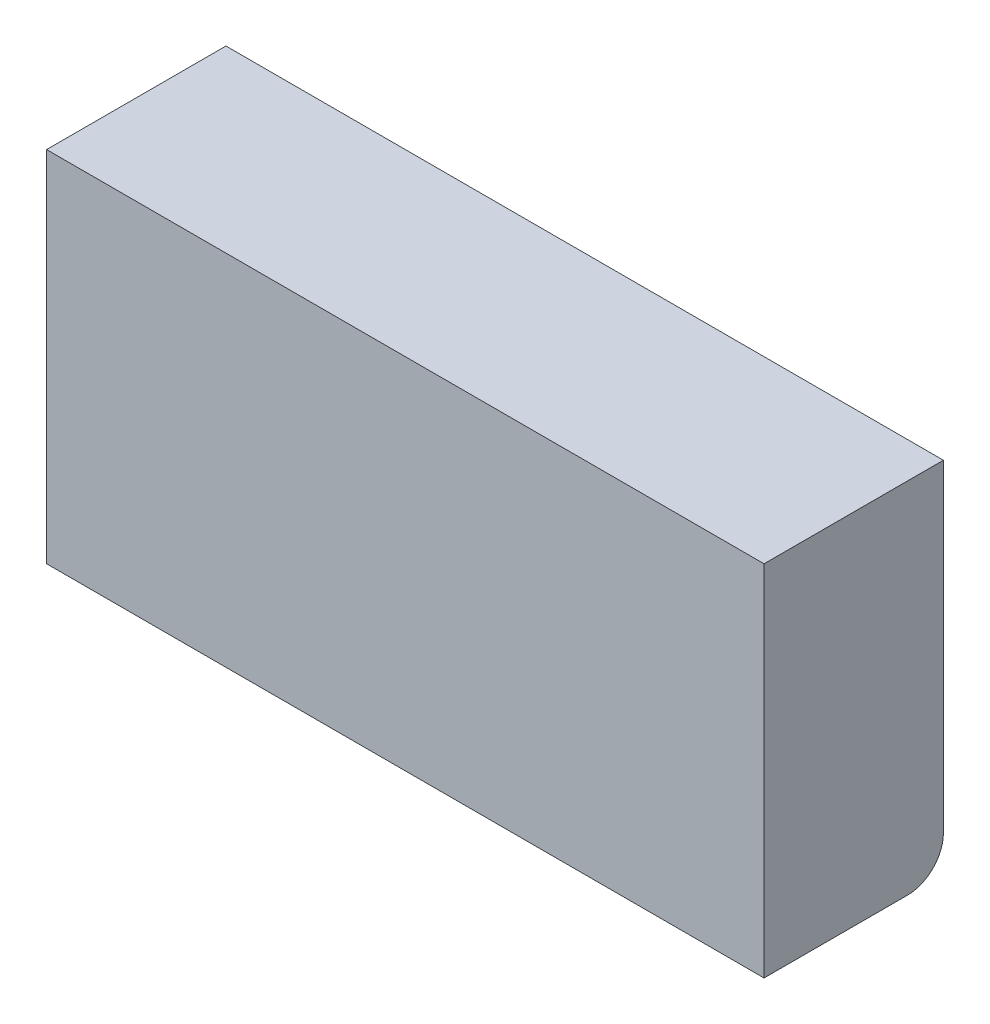
ISO-10303-21;
HEADER;
FILE_DESCRIPTION(('STEP AP214'),'2;1');
FILE_NAME('part.step','',(''),(''),'','','');
FILE_SCHEMA(('AUTOMOTIVE_DESIGN { 1 0 10303 214 1 1 1 1 }'));
ENDSEC;
DATA;
#1=APPLICATION_CONTEXT('core data for automotive mechanical design processes');
#2=APPLICATION_PROTOCOL_DEFINITION('international standard','automotive_design',2000,#1);
#3=PRODUCT_CONTEXT('',#1,'mechanical');
#4=PRODUCT('Part','Part','',(#3));
#5=PRODUCT_RELATED_PRODUCT_CATEGORY('part','',(#4));
#6=PRODUCT_DEFINITION_FORMATION('','',#4);
#7=PRODUCT_DEFINITION_CONTEXT('part definition',#1,'design');
#8=PRODUCT_DEFINITION('design','',#6,#7);
#9=PRODUCT_DEFINITION_SHAPE('','',#8);
#10=(LENGTH_UNIT() NAMED_UNIT(*) SI_UNIT(.MILLI.,.METRE.));
#11=(NAMED_UNIT(*) PLANE_ANGLE_UNIT() SI_UNIT($,.RADIAN.));
#12=(NAMED_UNIT(*) SI_UNIT($,.STERADIAN.) SOLID_ANGLE_UNIT());
#13=UNCERTAINTY_MEASURE_WITH_UNIT(LENGTH_MEASURE(1.E-05),#10,'distance_accuracy_value','');
#14=(GEOMETRIC_REPRESENTATION_CONTEXT(3) GLOBAL_UNCERTAINTY_ASSIGNED_CONTEXT((#13)) GLOBAL_UNIT_ASSIGNED_CONTEXT((#10,
#11,#12)) REPRESENTATION_CONTEXT('',''));
#15=CARTESIAN_POINT('',(0.,0.,0.));
#16=DIRECTION('',(0.,0.,1.));
#17=DIRECTION('',(1.,0.,0.));
#18=AXIS2_PLACEMENT_3D('',#15,#16,#17);
#19=CARTESIAN_POINT('',(0.,20.,10.));
#20=DIRECTION('',(1.,0.,0.));
#21=DIRECTION('',(0.,0.,-1.));
#22=AXIS2_PLACEMENT_3D('',#19,#20,#21);
#23=PLANE('',#22);
#24=DIRECTION('',(0.,-1.,0.));
#25=VECTOR('',#24,1.);
#26=CARTESIAN_POINT('',(0.,20.,0.));
#27=LINE('',#26,#25);
#28=CARTESIAN_POINT('',(0.,20.,0.));
#29=VERTEX_POINT('',#28);
#30=CARTESIAN_POINT('',(0.,2.,0.));
#31=VERTEX_POINT('',#30);
#32=EDGE_CURVE('E124',#29,#31,#27,.T.);
#33=ORIENTED_EDGE('',*,*,#32,.T.);
#34=CARTESIAN_POINT('',(0.,2.,2.));
#35=DIRECTION('',(1.,0.,0.));
#36=DIRECTION('',(0.,0.,-1.));
#37=AXIS2_PLACEMENT_3D('',#34,#35,#36);
#38=CIRCLE('',#37,2.);
#39=CARTESIAN_POINT('',(0.,0.,2.));
#40=VERTEX_POINT('',#39);
#41=EDGE_CURVE('E11',#31,#40,#38,.F.);
#42=ORIENTED_EDGE('',*,*,#41,.T.);
#43=DIRECTION('',(0.,0.,-1.));
#44=VECTOR('',#43,1.);
#45=CARTESIAN_POINT('',(0.,0.,10.));
#46=LINE('',#45,#44);
#47=CARTESIAN_POINT('',(0.,0.,10.));
#48=VERTEX_POINT('',#47);
#49=EDGE_CURVE('E92',#48,#40,#46,.T.);
#50=ORIENTED_EDGE('',*,*,#49,.F.);
#51=DIRECTION('',(0.,-1.,0.));
#52=VECTOR('',#51,1.);
#53=CARTESIAN_POINT('',(0.,20.,10.));
#54=LINE('',#53,#52);
#55=CARTESIAN_POINT('',(0.,20.,10.));
#56=VERTEX_POINT('',#55);
#57=EDGE_CURVE('E98',#56,#48,#54,.T.);
#58=ORIENTED_EDGE('',*,*,#57,.F.);
#59=DIRECTION('',(0.,0.,-1.));
#60=VECTOR('',#59,1.);
#61=CARTESIAN_POINT('',(0.,20.,10.));
#62=LINE('',#61,#60);
#63=EDGE_CURVE('E119',#56,#29,#62,.T.);
#64=ORIENTED_EDGE('',*,*,#63,.T.);
#65=EDGE_LOOP('',(#33,#42,#50,#58,#64));
#66=FACE_BOUND('',#65,.T.);
#67=ADVANCED_FACE('F41',(#66),#23,.F.);
#68=CARTESIAN_POINT('',(0.,0.,10.));
#69=DIRECTION('',(0.,1.,0.));
#70=DIRECTION('',(0.,0.,1.));
#71=AXIS2_PLACEMENT_3D('',#68,#69,#70);
#72=PLANE('',#71);
#73=ORIENTED_EDGE('',*,*,#49,.T.);
#74=DIRECTION('',(1.,0.,0.));
#75=VECTOR('',#74,1.);
#76=CARTESIAN_POINT('',(0.,0.,2.));
#77=LINE('',#76,#75);
#78=CARTESIAN_POINT('',(40.,0.,2.));
#79=VERTEX_POINT('',#78);
#80=EDGE_CURVE('E110',#40,#79,#77,.T.);
#81=ORIENTED_EDGE('',*,*,#80,.T.);
#82=DIRECTION('',(0.,0.,-1.));
#83=VECTOR('',#82,1.);
#84=CARTESIAN_POINT('',(40.,0.,10.));
#85=LINE('',#84,#83);
#86=CARTESIAN_POINT('',(40.,0.,10.));
#87=VERTEX_POINT('',#86);
#88=EDGE_CURVE('E94',#87,#79,#85,.T.);
#89=ORIENTED_EDGE('',*,*,#88,.F.);
#90=DIRECTION('',(1.,0.,0.));
#91=VECTOR('',#90,1.);
#92=CARTESIAN_POINT('',(0.,0.,10.));
#93=LINE('',#92,#91);
#94=EDGE_CURVE('E87',#48,#87,#93,.T.);
#95=ORIENTED_EDGE('',*,*,#94,.F.);
#96=EDGE_LOOP('',(#73,#81,#89,#95));
#97=FACE_BOUND('',#96,.T.);
#98=ADVANCED_FACE('F89',(#97),#72,.F.);
#99=CARTESIAN_POINT('',(40.,0.,10.));
#100=DIRECTION('',(-1.,0.,0.));
#101=DIRECTION('',(0.,0.,1.));
#102=AXIS2_PLACEMENT_3D('',#99,#100,#101);
#103=PLANE('',#102);
#104=ORIENTED_EDGE('',*,*,#88,.T.);
#105=CARTESIAN_POINT('',(40.,2.,2.));
#106=DIRECTION('',(-1.,0.,0.));
#107=DIRECTION('',(0.,0.,1.));
#108=AXIS2_PLACEMENT_3D('',#105,#106,#107);
#109=CIRCLE('',#108,2.);
#110=CARTESIAN_POINT('',(40.,2.,0.));
#111=VERTEX_POINT('',#110);
#112=EDGE_CURVE('E63',#79,#111,#109,.F.);
#113=ORIENTED_EDGE('',*,*,#112,.T.);
#114=DIRECTION('',(0.,1.,0.));
#115=VECTOR('',#114,1.);
#116=CARTESIAN_POINT('',(40.,0.,0.));
#117=LINE('',#116,#115);
#118=CARTESIAN_POINT('',(40.,20.,0.));
#119=VERTEX_POINT('',#118);
#120=EDGE_CURVE('E122',#111,#119,#117,.T.);
#121=ORIENTED_EDGE('',*,*,#120,.T.);
#122=DIRECTION('',(0.,0.,-1.));
#123=VECTOR('',#122,1.);
#124=CARTESIAN_POINT('',(40.,20.,10.));
#125=LINE('',#124,#123);
#126=CARTESIAN_POINT('',(40.,20.,10.));
#127=VERTEX_POINT('',#126);
#128=EDGE_CURVE('E113',#127,#119,#125,.T.);
#129=ORIENTED_EDGE('',*,*,#128,.F.);
#130=DIRECTION('',(0.,1.,0.));
#131=VECTOR('',#130,1.);
#132=CARTESIAN_POINT('',(40.,0.,10.));
#133=LINE('',#132,#131);
#134=EDGE_CURVE('E97',#87,#127,#133,.T.);
#135=ORIENTED_EDGE('',*,*,#134,.F.);
#136=EDGE_LOOP('',(#104,#113,#121,#129,#135));
#137=FACE_BOUND('',#136,.T.);
#138=ADVANCED_FACE('F128',(#137),#103,.F.);
#139=CARTESIAN_POINT('',(40.,20.,10.));
#140=DIRECTION('',(0.,-1.,0.));
#141=DIRECTION('',(0.,0.,-1.));
#142=AXIS2_PLACEMENT_3D('',#139,#140,#141);
#143=PLANE('',#142);
#144=DIRECTION('',(-1.,0.,0.));
#145=VECTOR('',#144,1.);
#146=CARTESIAN_POINT('',(40.,20.,0.));
#147=LINE('',#146,#145);
#148=EDGE_CURVE('E107',#119,#29,#147,.T.);
#149=ORIENTED_EDGE('',*,*,#148,.T.);
#150=ORIENTED_EDGE('',*,*,#63,.F.);
#151=DIRECTION('',(-1.,0.,0.));
#152=VECTOR('',#151,1.);
#153=CARTESIAN_POINT('',(40.,20.,10.));
#154=LINE('',#153,#152);
#155=EDGE_CURVE('E103',#127,#56,#154,.T.);
#156=ORIENTED_EDGE('',*,*,#155,.F.);
#157=ORIENTED_EDGE('',*,*,#128,.T.);
#158=EDGE_LOOP('',(#149,#150,#156,#157));
#159=FACE_BOUND('',#158,.T.);
#160=ADVANCED_FACE('F131',(#159),#143,.F.);
#161=CARTESIAN_POINT('',(0.,0.,10.));
#162=DIRECTION('',(0.,0.,1.));
#163=DIRECTION('',(1.,0.,0.));
#164=AXIS2_PLACEMENT_3D('',#161,#162,#163);
#165=PLANE('',#164);
#166=ORIENTED_EDGE('',*,*,#57,.T.);
#167=ORIENTED_EDGE('',*,*,#94,.T.);
#168=ORIENTED_EDGE('',*,*,#134,.T.);
#169=ORIENTED_EDGE('',*,*,#155,.T.);
#170=EDGE_LOOP('',(#166,#167,#168,#169));
#171=FACE_BOUND('',#170,.T.);
#172=ADVANCED_FACE('F101',(#171),#165,.T.);
#173=CARTESIAN_POINT('',(0.,0.,0.));
#174=DIRECTION('',(0.,0.,1.));
#175=DIRECTION('',(1.,0.,0.));
#176=AXIS2_PLACEMENT_3D('',#173,#174,#175);
#177=PLANE('',#176);
#178=ORIENTED_EDGE('',*,*,#120,.F.);
#179=DIRECTION('',(1.,0.,0.));
#180=VECTOR('',#179,1.);
#181=CARTESIAN_POINT('',(0.,2.,0.));
#182=LINE('',#181,#180);
#183=EDGE_CURVE('E49',#111,#31,#182,.F.);
#184=ORIENTED_EDGE('',*,*,#183,.T.);
#185=ORIENTED_EDGE('',*,*,#32,.F.);
#186=ORIENTED_EDGE('',*,*,#148,.F.);
#187=EDGE_LOOP('',(#178,#184,#185,#186));
#188=FACE_BOUND('',#187,.T.);
#189=ADVANCED_FACE('F132',(#188),#177,.F.);
#190=CARTESIAN_POINT('',(0.,2.,2.));
#191=DIRECTION('',(1.,0.,0.));
#192=DIRECTION('',(0.,0.,-1.));
#193=AXIS2_PLACEMENT_3D('',#190,#191,#192);
#194=CYLINDRICAL_SURFACE('',#193,2.);
#195=ORIENTED_EDGE('',*,*,#41,.F.);
#196=ORIENTED_EDGE('',*,*,#183,.F.);
#197=ORIENTED_EDGE('',*,*,#112,.F.);
#198=ORIENTED_EDGE('',*,*,#80,.F.);
#199=EDGE_LOOP('',(#195,#196,#197,#198));
#200=FACE_BOUND('',#199,.T.);
#201=ADVANCED_FACE('F43',(#200),#194,.T.);
#202=CLOSED_SHELL('',(#67,#98,#138,#160,#172,#189,#201));
#203=MANIFOLD_SOLID_BREP('B2',#202);
#204=ADVANCED_BREP_SHAPE_REPRESENTATION('',(#18,#203),#14);
#205=SHAPE_DEFINITION_REPRESENTATION(#9,#204);
ENDSEC;
END-ISO-10303-21;
